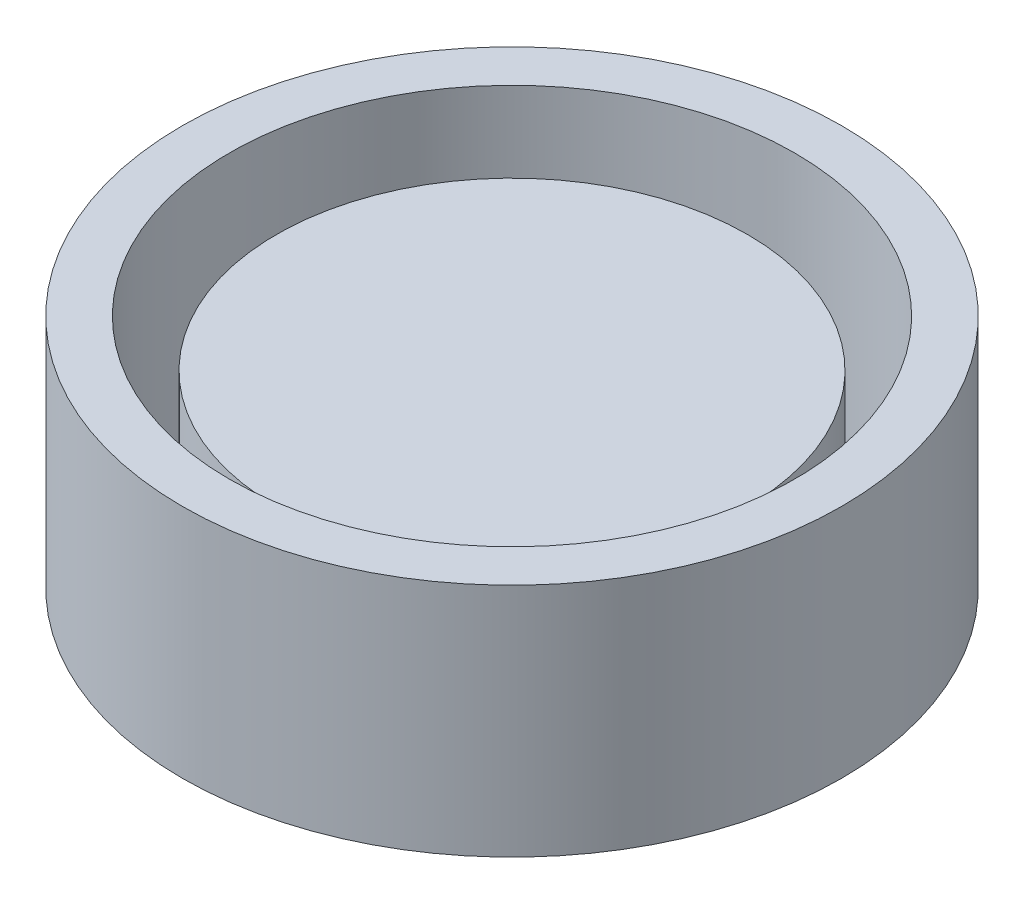
ISO-10303-21;
HEADER;
FILE_DESCRIPTION(('STEP AP214'),'2;1');
FILE_NAME('part.step','',(''),(''),'','','');
FILE_SCHEMA(('AUTOMOTIVE_DESIGN { 1 0 10303 214 1 1 1 1 }'));
ENDSEC;
DATA;
#1=APPLICATION_CONTEXT('core data for automotive mechanical design processes');
#2=APPLICATION_PROTOCOL_DEFINITION('international standard','automotive_design',2000,#1);
#3=PRODUCT_CONTEXT('',#1,'mechanical');
#4=PRODUCT('Part','Part','',(#3));
#5=PRODUCT_RELATED_PRODUCT_CATEGORY('part','',(#4));
#6=PRODUCT_DEFINITION_FORMATION('','',#4);
#7=PRODUCT_DEFINITION_CONTEXT('part definition',#1,'design');
#8=PRODUCT_DEFINITION('design','',#6,#7);
#9=PRODUCT_DEFINITION_SHAPE('','',#8);
#10=(LENGTH_UNIT() NAMED_UNIT(*) SI_UNIT(.MILLI.,.METRE.));
#11=(NAMED_UNIT(*) PLANE_ANGLE_UNIT() SI_UNIT($,.RADIAN.));
#12=(NAMED_UNIT(*) SI_UNIT($,.STERADIAN.) SOLID_ANGLE_UNIT());
#13=UNCERTAINTY_MEASURE_WITH_UNIT(LENGTH_MEASURE(1.E-05),#10,'distance_accuracy_value','');
#14=(GEOMETRIC_REPRESENTATION_CONTEXT(3) GLOBAL_UNCERTAINTY_ASSIGNED_CONTEXT((#13)) GLOBAL_UNIT_ASSIGNED_CONTEXT((#10,
#11,#12)) REPRESENTATION_CONTEXT('',''));
#15=CARTESIAN_POINT('',(0.,0.,0.));
#16=DIRECTION('',(0.,0.,1.));
#17=DIRECTION('',(1.,0.,0.));
#18=AXIS2_PLACEMENT_3D('',#15,#16,#17);
#19=CARTESIAN_POINT('',(0.,5000.,0.));
#20=DIRECTION('',(0.,-1.,0.));
#21=DIRECTION('',(0.,0.,-1.));
#22=AXIS2_PLACEMENT_3D('',#19,#20,#21);
#23=CYLINDRICAL_SURFACE('',#22,6000.);
#24=CARTESIAN_POINT('',(0.,5000.,0.));
#25=DIRECTION('',(0.,1.,0.));
#26=DIRECTION('',(0.,0.,1.));
#27=AXIS2_PLACEMENT_3D('',#24,#25,#26);
#28=CIRCLE('',#27,6000.);
#29=CARTESIAN_POINT('',(0.,5000.,6000.));
#30=VERTEX_POINT('',#29);
#31=EDGE_CURVE('E46',#30,#30,#28,.T.);
#32=ORIENTED_EDGE('',*,*,#31,.T.);
#33=EDGE_LOOP('',(#32));
#34=FACE_BOUND('',#33,.T.);
#35=CARTESIAN_POINT('',(0.,0.,0.));
#36=DIRECTION('',(0.,1.,0.));
#37=DIRECTION('',(0.,0.,1.));
#38=AXIS2_PLACEMENT_3D('',#35,#36,#37);
#39=CIRCLE('',#38,6000.);
#40=CARTESIAN_POINT('',(0.,0.,6000.));
#41=VERTEX_POINT('',#40);
#42=EDGE_CURVE('E52',#41,#41,#39,.T.);
#43=ORIENTED_EDGE('',*,*,#42,.F.);
#44=EDGE_LOOP('',(#43));
#45=FACE_BOUND('',#44,.T.);
#46=ADVANCED_FACE('F39',(#34,#45),#23,.F.);
#47=CARTESIAN_POINT('',(0.,5000.,0.));
#48=DIRECTION('',(0.,-1.,0.));
#49=DIRECTION('',(0.,0.,-1.));
#50=AXIS2_PLACEMENT_3D('',#47,#48,#49);
#51=CYLINDRICAL_SURFACE('',#50,7000.);
#52=CARTESIAN_POINT('',(0.,5000.,0.));
#53=DIRECTION('',(0.,1.,0.));
#54=DIRECTION('',(0.,0.,1.));
#55=AXIS2_PLACEMENT_3D('',#52,#53,#54);
#56=CIRCLE('',#55,7000.);
#57=CARTESIAN_POINT('',(0.,5000.,7000.));
#58=VERTEX_POINT('',#57);
#59=EDGE_CURVE('E11',#58,#58,#56,.T.);
#60=ORIENTED_EDGE('',*,*,#59,.F.);
#61=EDGE_LOOP('',(#60));
#62=FACE_BOUND('',#61,.T.);
#63=CARTESIAN_POINT('',(0.,0.,0.));
#64=DIRECTION('',(0.,1.,0.));
#65=DIRECTION('',(0.,0.,1.));
#66=AXIS2_PLACEMENT_3D('',#63,#64,#65);
#67=CIRCLE('',#66,7000.);
#68=CARTESIAN_POINT('',(0.,0.,7000.));
#69=VERTEX_POINT('',#68);
#70=EDGE_CURVE('E42',#69,#69,#67,.T.);
#71=ORIENTED_EDGE('',*,*,#70,.T.);
#72=EDGE_LOOP('',(#71));
#73=FACE_BOUND('',#72,.T.);
#74=ADVANCED_FACE('F59',(#62,#73),#51,.T.);
#75=CARTESIAN_POINT('',(0.,5000.,0.));
#76=DIRECTION('',(0.,1.,0.));
#77=DIRECTION('',(0.,0.,1.));
#78=AXIS2_PLACEMENT_3D('',#75,#76,#77);
#79=PLANE('',#78);
#80=ORIENTED_EDGE('',*,*,#31,.F.);
#81=EDGE_LOOP('',(#80));
#82=FACE_BOUND('',#81,.T.);
#83=ORIENTED_EDGE('',*,*,#59,.T.);
#84=EDGE_LOOP('',(#83));
#85=FACE_BOUND('',#84,.T.);
#86=ADVANCED_FACE('F63',(#82,#85),#79,.T.);
#87=CARTESIAN_POINT('',(0.,0.,0.));
#88=DIRECTION('',(0.,1.,0.));
#89=DIRECTION('',(0.,0.,1.));
#90=AXIS2_PLACEMENT_3D('',#87,#88,#89);
#91=PLANE('',#90);
#92=ORIENTED_EDGE('',*,*,#42,.T.);
#93=EDGE_LOOP('',(#92));
#94=FACE_BOUND('',#93,.T.);
#95=ORIENTED_EDGE('',*,*,#70,.F.);
#96=EDGE_LOOP('',(#95));
#97=FACE_BOUND('',#96,.T.);
#98=ADVANCED_FACE('F61',(#94,#97),#91,.F.);
#99=CLOSED_SHELL('',(#46,#74,#86,#98));
#100=MANIFOLD_SOLID_BREP('B2',#99);
#101=CARTESIAN_POINT('',(0.,4000.,0.));
#102=DIRECTION('',(0.,-1.,0.));
#103=DIRECTION('',(0.,0.,-1.));
#104=AXIS2_PLACEMENT_3D('',#101,#102,#103);
#105=CYLINDRICAL_SURFACE('',#104,5000.);
#106=CARTESIAN_POINT('',(0.,4000.,0.));
#107=DIRECTION('',(0.,1.,0.));
#108=DIRECTION('',(0.,0.,1.));
#109=AXIS2_PLACEMENT_3D('',#106,#107,#108);
#110=CIRCLE('',#109,5000.);
#111=CARTESIAN_POINT('',(0.,4000.,5000.));
#112=VERTEX_POINT('',#111);
#113=EDGE_CURVE('E38',#112,#112,#110,.T.);
#114=ORIENTED_EDGE('',*,*,#113,.F.);
#115=EDGE_LOOP('',(#114));
#116=FACE_BOUND('',#115,.T.);
#117=CARTESIAN_POINT('',(0.,0.,0.));
#118=DIRECTION('',(0.,1.,0.));
#119=DIRECTION('',(0.,0.,1.));
#120=AXIS2_PLACEMENT_3D('',#117,#118,#119);
#121=CIRCLE('',#120,5000.);
#122=CARTESIAN_POINT('',(0.,0.,5000.));
#123=VERTEX_POINT('',#122);
#124=EDGE_CURVE('E104',#123,#123,#121,.T.);
#125=ORIENTED_EDGE('',*,*,#124,.T.);
#126=EDGE_LOOP('',(#125));
#127=FACE_BOUND('',#126,.T.);
#128=ADVANCED_FACE('F101',(#116,#127),#105,.T.);
#129=CARTESIAN_POINT('',(0.,4000.,0.));
#130=DIRECTION('',(0.,1.,0.));
#131=DIRECTION('',(0.,0.,1.));
#132=AXIS2_PLACEMENT_3D('',#129,#130,#131);
#133=PLANE('',#132);
#134=ORIENTED_EDGE('',*,*,#113,.T.);
#135=EDGE_LOOP('',(#134));
#136=FACE_BOUND('',#135,.T.);
#137=ADVANCED_FACE('F116',(#136),#133,.T.);
#138=CARTESIAN_POINT('',(0.,0.,0.));
#139=DIRECTION('',(0.,1.,0.));
#140=DIRECTION('',(0.,0.,1.));
#141=AXIS2_PLACEMENT_3D('',#138,#139,#140);
#142=PLANE('',#141);
#143=ORIENTED_EDGE('',*,*,#124,.F.);
#144=EDGE_LOOP('',(#143));
#145=FACE_BOUND('',#144,.T.);
#146=ADVANCED_FACE('F114',(#145),#142,.F.);
#147=CLOSED_SHELL('',(#128,#137,#146));
#148=MANIFOLD_SOLID_BREP('B6',#147);
#149=ADVANCED_BREP_SHAPE_REPRESENTATION('',(#18,#100,#148),#14);
#150=SHAPE_DEFINITION_REPRESENTATION(#9,#149);
ENDSEC;
END-ISO-10303-21;
